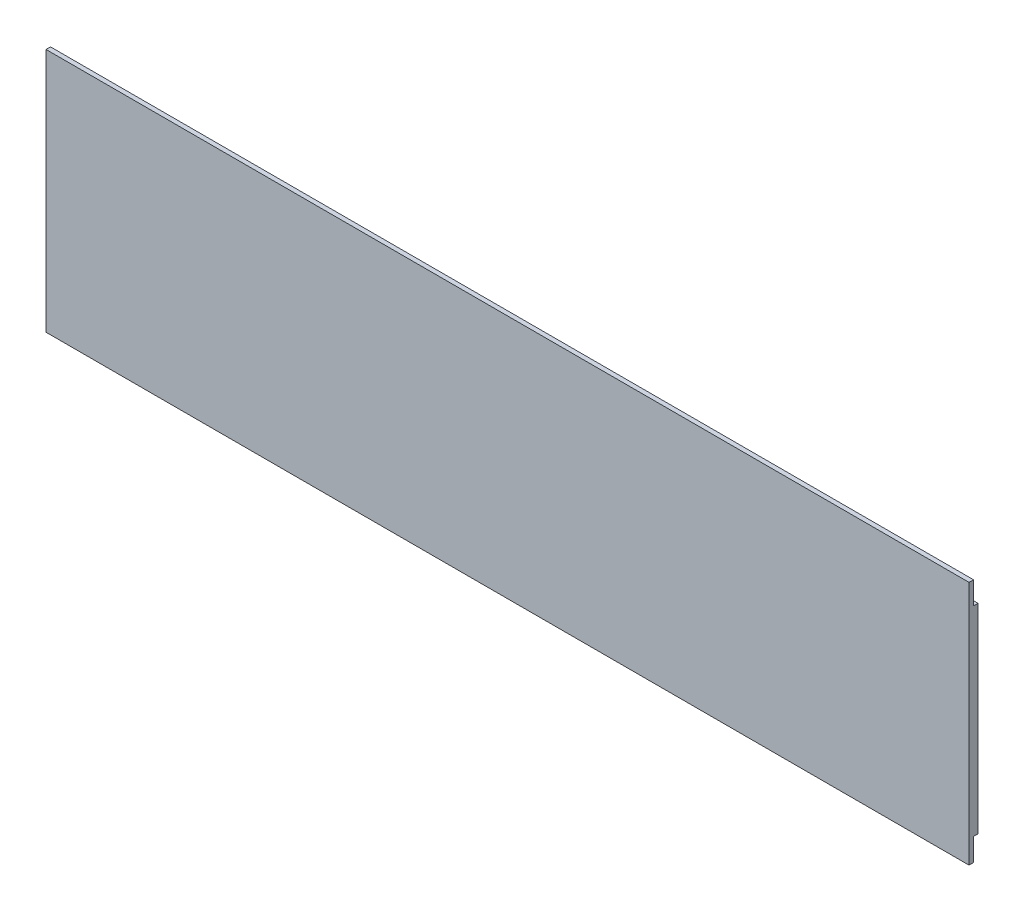
ISO-10303-21;
HEADER;
FILE_DESCRIPTION(('STEP AP214'),'2;1');
FILE_NAME('part.step','',(''),(''),'','','');
FILE_SCHEMA(('AUTOMOTIVE_DESIGN { 1 0 10303 214 1 1 1 1 }'));
ENDSEC;
DATA;
#1=APPLICATION_CONTEXT('core data for automotive mechanical design processes');
#2=APPLICATION_PROTOCOL_DEFINITION('international standard','automotive_design',2000,#1);
#3=PRODUCT_CONTEXT('',#1,'mechanical');
#4=PRODUCT('Part','Part','',(#3));
#5=PRODUCT_RELATED_PRODUCT_CATEGORY('part','',(#4));
#6=PRODUCT_DEFINITION_FORMATION('','',#4);
#7=PRODUCT_DEFINITION_CONTEXT('part definition',#1,'design');
#8=PRODUCT_DEFINITION('design','',#6,#7);
#9=PRODUCT_DEFINITION_SHAPE('','',#8);
#10=(LENGTH_UNIT() NAMED_UNIT(*) SI_UNIT(.MILLI.,.METRE.));
#11=(NAMED_UNIT(*) PLANE_ANGLE_UNIT() SI_UNIT($,.RADIAN.));
#12=(NAMED_UNIT(*) SI_UNIT($,.STERADIAN.) SOLID_ANGLE_UNIT());
#13=UNCERTAINTY_MEASURE_WITH_UNIT(LENGTH_MEASURE(1.E-05),#10,'distance_accuracy_value','');
#14=(GEOMETRIC_REPRESENTATION_CONTEXT(3) GLOBAL_UNCERTAINTY_ASSIGNED_CONTEXT((#13)) GLOBAL_UNIT_ASSIGNED_CONTEXT((#10,
#11,#12)) REPRESENTATION_CONTEXT('',''));
#15=CARTESIAN_POINT('',(0.,0.,0.));
#16=DIRECTION('',(0.,0.,1.));
#17=DIRECTION('',(1.,0.,0.));
#18=AXIS2_PLACEMENT_3D('',#15,#16,#17);
#19=CARTESIAN_POINT('',(0.,86.566214514811,3.175));
#20=DIRECTION('',(0.,-1.,0.));
#21=DIRECTION('',(0.,0.,-1.));
#22=AXIS2_PLACEMENT_3D('',#19,#20,#21);
#23=PLANE('',#22);
#24=DIRECTION('',(1.,0.,0.));
#25=VECTOR('',#24,1.);
#26=CARTESIAN_POINT('',(326.228,86.566214514811,1.5875));
#27=LINE('',#26,#25);
#28=CARTESIAN_POINT('',(0.,86.566214514811,1.5875));
#29=VERTEX_POINT('',#28);
#30=CARTESIAN_POINT('',(326.228,86.566214514811,1.5875));
#31=VERTEX_POINT('',#30);
#32=EDGE_CURVE('E144',#29,#31,#27,.T.);
#33=ORIENTED_EDGE('',*,*,#32,.F.);
#34=DIRECTION('',(0.,0.,-1.));
#35=VECTOR('',#34,1.);
#36=CARTESIAN_POINT('',(0.,86.566214514811,3.175));
#37=LINE('',#36,#35);
#38=CARTESIAN_POINT('',(0.,86.566214514811,3.175));
#39=VERTEX_POINT('',#38);
#40=EDGE_CURVE('E122',#39,#29,#37,.T.);
#41=ORIENTED_EDGE('',*,*,#40,.F.);
#42=DIRECTION('',(-1.,0.,0.));
#43=VECTOR('',#42,1.);
#44=CARTESIAN_POINT('',(0.,86.566214514811,3.175));
#45=LINE('',#44,#43);
#46=CARTESIAN_POINT('',(326.228,86.566214514811,3.175));
#47=VERTEX_POINT('',#46);
#48=EDGE_CURVE('E127',#47,#39,#45,.T.);
#49=ORIENTED_EDGE('',*,*,#48,.F.);
#50=DIRECTION('',(0.,0.,-1.));
#51=VECTOR('',#50,1.);
#52=CARTESIAN_POINT('',(326.228,86.566214514811,3.175));
#53=LINE('',#52,#51);
#54=EDGE_CURVE('E120',#47,#31,#53,.T.);
#55=ORIENTED_EDGE('',*,*,#54,.T.);
#56=EDGE_LOOP('',(#33,#41,#49,#55));
#57=FACE_BOUND('',#56,.T.);
#58=ADVANCED_FACE('F33',(#57),#23,.F.);
#59=CARTESIAN_POINT('',(0.,0.,3.175));
#60=DIRECTION('',(1.,0.,0.));
#61=DIRECTION('',(0.,0.,-1.));
#62=AXIS2_PLACEMENT_3D('',#59,#60,#61);
#63=PLANE('',#62);
#64=DIRECTION('',(0.,-1.,0.));
#65=VECTOR('',#64,1.);
#66=CARTESIAN_POINT('',(0.,0.,0.));
#67=LINE('',#66,#65);
#68=CARTESIAN_POINT('',(0.,78.5662145148111,0.));
#69=VERTEX_POINT('',#68);
#70=CARTESIAN_POINT('',(0.,7.99999999999999,0.));
#71=VERTEX_POINT('',#70);
#72=EDGE_CURVE('E132',#69,#71,#67,.T.);
#73=ORIENTED_EDGE('',*,*,#72,.T.);
#74=DIRECTION('',(0.,0.,-1.));
#75=VECTOR('',#74,1.);
#76=CARTESIAN_POINT('',(0.,7.99999999999999,1.5875));
#77=LINE('',#76,#75);
#78=CARTESIAN_POINT('',(0.,7.99999999999999,1.5875));
#79=VERTEX_POINT('',#78);
#80=EDGE_CURVE('E56',#79,#71,#77,.T.);
#81=ORIENTED_EDGE('',*,*,#80,.F.);
#82=DIRECTION('',(0.,1.,0.));
#83=VECTOR('',#82,1.);
#84=CARTESIAN_POINT('',(0.,0.,1.5875));
#85=LINE('',#84,#83);
#86=CARTESIAN_POINT('',(0.,0.,1.5875));
#87=VERTEX_POINT('',#86);
#88=EDGE_CURVE('E115',#87,#79,#85,.T.);
#89=ORIENTED_EDGE('',*,*,#88,.F.);
#90=DIRECTION('',(0.,0.,-1.));
#91=VECTOR('',#90,1.);
#92=CARTESIAN_POINT('',(0.,0.,3.175));
#93=LINE('',#92,#91);
#94=CARTESIAN_POINT('',(0.,0.,3.175));
#95=VERTEX_POINT('',#94);
#96=EDGE_CURVE('E11',#95,#87,#93,.T.);
#97=ORIENTED_EDGE('',*,*,#96,.F.);
#98=DIRECTION('',(0.,-1.,0.));
#99=VECTOR('',#98,1.);
#100=CARTESIAN_POINT('',(0.,0.,3.175));
#101=LINE('',#100,#99);
#102=EDGE_CURVE('E131',#39,#95,#101,.T.);
#103=ORIENTED_EDGE('',*,*,#102,.F.);
#104=ORIENTED_EDGE('',*,*,#40,.T.);
#105=DIRECTION('',(0.,1.,0.));
#106=VECTOR('',#105,1.);
#107=CARTESIAN_POINT('',(0.,86.566214514811,1.5875));
#108=LINE('',#107,#106);
#109=CARTESIAN_POINT('',(0.,78.5662145148111,1.5875));
#110=VERTEX_POINT('',#109);
#111=EDGE_CURVE('E151',#110,#29,#108,.T.);
#112=ORIENTED_EDGE('',*,*,#111,.F.);
#113=DIRECTION('',(0.,0.,-1.));
#114=VECTOR('',#113,1.);
#115=CARTESIAN_POINT('',(0.,78.5662145148111,1.5875));
#116=LINE('',#115,#114);
#117=EDGE_CURVE('E143',#110,#69,#116,.T.);
#118=ORIENTED_EDGE('',*,*,#117,.T.);
#119=EDGE_LOOP('',(#73,#81,#89,#97,#103,#104,#112,#118));
#120=FACE_BOUND('',#119,.T.);
#121=ADVANCED_FACE('F35',(#120),#63,.F.);
#122=CARTESIAN_POINT('',(0.,0.,3.175));
#123=DIRECTION('',(0.,1.,0.));
#124=DIRECTION('',(0.,0.,1.));
#125=AXIS2_PLACEMENT_3D('',#122,#123,#124);
#126=PLANE('',#125);
#127=ORIENTED_EDGE('',*,*,#96,.T.);
#128=DIRECTION('',(-1.,0.,0.));
#129=VECTOR('',#128,1.);
#130=CARTESIAN_POINT('',(326.228,0.,1.5875));
#131=LINE('',#130,#129);
#132=CARTESIAN_POINT('',(326.228,0.,1.5875));
#133=VERTEX_POINT('',#132);
#134=EDGE_CURVE('E102',#133,#87,#131,.T.);
#135=ORIENTED_EDGE('',*,*,#134,.F.);
#136=DIRECTION('',(0.,0.,-1.));
#137=VECTOR('',#136,1.);
#138=CARTESIAN_POINT('',(326.228,0.,3.175));
#139=LINE('',#138,#137);
#140=CARTESIAN_POINT('',(326.228,0.,3.175));
#141=VERTEX_POINT('',#140);
#142=EDGE_CURVE('E41',#141,#133,#139,.T.);
#143=ORIENTED_EDGE('',*,*,#142,.F.);
#144=DIRECTION('',(1.,0.,0.));
#145=VECTOR('',#144,1.);
#146=CARTESIAN_POINT('',(0.,0.,3.175));
#147=LINE('',#146,#145);
#148=EDGE_CURVE('E138',#95,#141,#147,.T.);
#149=ORIENTED_EDGE('',*,*,#148,.F.);
#150=EDGE_LOOP('',(#127,#135,#143,#149));
#151=FACE_BOUND('',#150,.T.);
#152=ADVANCED_FACE('F112',(#151),#126,.F.);
#153=CARTESIAN_POINT('',(326.228,0.,3.175));
#154=DIRECTION('',(-1.,0.,0.));
#155=DIRECTION('',(0.,0.,1.));
#156=AXIS2_PLACEMENT_3D('',#153,#154,#155);
#157=PLANE('',#156);
#158=DIRECTION('',(0.,-1.,0.));
#159=VECTOR('',#158,1.);
#160=CARTESIAN_POINT('',(326.228,0.,1.5875));
#161=LINE('',#160,#159);
#162=CARTESIAN_POINT('',(326.228,7.99999999999999,1.5875));
#163=VERTEX_POINT('',#162);
#164=EDGE_CURVE('E99',#163,#133,#161,.T.);
#165=ORIENTED_EDGE('',*,*,#164,.F.);
#166=DIRECTION('',(0.,0.,-1.));
#167=VECTOR('',#166,1.);
#168=CARTESIAN_POINT('',(326.228,7.99999999999999,1.5875));
#169=LINE('',#168,#167);
#170=CARTESIAN_POINT('',(326.228,7.99999999999999,0.));
#171=VERTEX_POINT('',#170);
#172=EDGE_CURVE('E135',#163,#171,#169,.T.);
#173=ORIENTED_EDGE('',*,*,#172,.T.);
#174=DIRECTION('',(0.,1.,0.));
#175=VECTOR('',#174,1.);
#176=CARTESIAN_POINT('',(326.228,0.,0.));
#177=LINE('',#176,#175);
#178=CARTESIAN_POINT('',(326.228,78.5662145148111,0.));
#179=VERTEX_POINT('',#178);
#180=EDGE_CURVE('E128',#171,#179,#177,.T.);
#181=ORIENTED_EDGE('',*,*,#180,.T.);
#182=DIRECTION('',(0.,0.,-1.));
#183=VECTOR('',#182,1.);
#184=CARTESIAN_POINT('',(326.228,78.5662145148111,1.5875));
#185=LINE('',#184,#183);
#186=CARTESIAN_POINT('',(326.228,78.5662145148111,1.5875));
#187=VERTEX_POINT('',#186);
#188=EDGE_CURVE('E48',#187,#179,#185,.T.);
#189=ORIENTED_EDGE('',*,*,#188,.F.);
#190=DIRECTION('',(0.,-1.,0.));
#191=VECTOR('',#190,1.);
#192=CARTESIAN_POINT('',(326.228,86.566214514811,1.5875));
#193=LINE('',#192,#191);
#194=EDGE_CURVE('E149',#31,#187,#193,.T.);
#195=ORIENTED_EDGE('',*,*,#194,.F.);
#196=ORIENTED_EDGE('',*,*,#54,.F.);
#197=DIRECTION('',(0.,1.,0.));
#198=VECTOR('',#197,1.);
#199=CARTESIAN_POINT('',(326.228,0.,3.175));
#200=LINE('',#199,#198);
#201=EDGE_CURVE('E119',#141,#47,#200,.T.);
#202=ORIENTED_EDGE('',*,*,#201,.F.);
#203=ORIENTED_EDGE('',*,*,#142,.T.);
#204=EDGE_LOOP('',(#165,#173,#181,#189,#195,#196,#202,#203));
#205=FACE_BOUND('',#204,.T.);
#206=ADVANCED_FACE('F117',(#205),#157,.F.);
#207=CARTESIAN_POINT('',(0.,0.,3.175));
#208=DIRECTION('',(0.,0.,-1.));
#209=DIRECTION('',(-1.,0.,0.));
#210=AXIS2_PLACEMENT_3D('',#207,#208,#209);
#211=PLANE('',#210);
#212=ORIENTED_EDGE('',*,*,#102,.T.);
#213=ORIENTED_EDGE('',*,*,#148,.T.);
#214=ORIENTED_EDGE('',*,*,#201,.T.);
#215=ORIENTED_EDGE('',*,*,#48,.T.);
#216=EDGE_LOOP('',(#212,#213,#214,#215));
#217=FACE_BOUND('',#216,.T.);
#218=ADVANCED_FACE('F177',(#217),#211,.F.);
#219=CARTESIAN_POINT('',(0.,0.,0.));
#220=DIRECTION('',(0.,0.,-1.));
#221=DIRECTION('',(-1.,0.,0.));
#222=AXIS2_PLACEMENT_3D('',#219,#220,#221);
#223=PLANE('',#222);
#224=DIRECTION('',(1.,0.,0.));
#225=VECTOR('',#224,1.);
#226=CARTESIAN_POINT('',(326.228,7.99999999999999,0.));
#227=LINE('',#226,#225);
#228=EDGE_CURVE('E108',#71,#171,#227,.T.);
#229=ORIENTED_EDGE('',*,*,#228,.F.);
#230=ORIENTED_EDGE('',*,*,#72,.F.);
#231=DIRECTION('',(-1.,0.,0.));
#232=VECTOR('',#231,1.);
#233=CARTESIAN_POINT('',(326.228,78.5662145148111,0.));
#234=LINE('',#233,#232);
#235=EDGE_CURVE('E147',#179,#69,#234,.T.);
#236=ORIENTED_EDGE('',*,*,#235,.F.);
#237=ORIENTED_EDGE('',*,*,#180,.F.);
#238=EDGE_LOOP('',(#229,#230,#236,#237));
#239=FACE_BOUND('',#238,.T.);
#240=ADVANCED_FACE('F167',(#239),#223,.T.);
#241=CARTESIAN_POINT('',(326.228,78.5662145148111,1.5875));
#242=DIRECTION('',(0.,-1.,0.));
#243=DIRECTION('',(0.,0.,-1.));
#244=AXIS2_PLACEMENT_3D('',#241,#242,#243);
#245=PLANE('',#244);
#246=ORIENTED_EDGE('',*,*,#235,.T.);
#247=ORIENTED_EDGE('',*,*,#117,.F.);
#248=DIRECTION('',(-1.,0.,0.));
#249=VECTOR('',#248,1.);
#250=CARTESIAN_POINT('',(326.228,78.5662145148111,1.5875));
#251=LINE('',#250,#249);
#252=EDGE_CURVE('E153',#187,#110,#251,.T.);
#253=ORIENTED_EDGE('',*,*,#252,.F.);
#254=ORIENTED_EDGE('',*,*,#188,.T.);
#255=EDGE_LOOP('',(#246,#247,#253,#254));
#256=FACE_BOUND('',#255,.T.);
#257=ADVANCED_FACE('F179',(#256),#245,.F.);
#258=CARTESIAN_POINT('',(0.,0.,1.5875));
#259=DIRECTION('',(0.,0.,-1.));
#260=DIRECTION('',(-1.,0.,0.));
#261=AXIS2_PLACEMENT_3D('',#258,#259,#260);
#262=PLANE('',#261);
#263=ORIENTED_EDGE('',*,*,#194,.T.);
#264=ORIENTED_EDGE('',*,*,#252,.T.);
#265=ORIENTED_EDGE('',*,*,#111,.T.);
#266=ORIENTED_EDGE('',*,*,#32,.T.);
#267=EDGE_LOOP('',(#263,#264,#265,#266));
#268=FACE_BOUND('',#267,.T.);
#269=ADVANCED_FACE('F178',(#268),#262,.T.);
#270=CARTESIAN_POINT('',(326.228,7.99999999999999,1.5875));
#271=DIRECTION('',(0.,1.,0.));
#272=DIRECTION('',(0.,0.,1.));
#273=AXIS2_PLACEMENT_3D('',#270,#271,#272);
#274=PLANE('',#273);
#275=ORIENTED_EDGE('',*,*,#228,.T.);
#276=ORIENTED_EDGE('',*,*,#172,.F.);
#277=DIRECTION('',(1.,0.,0.));
#278=VECTOR('',#277,1.);
#279=CARTESIAN_POINT('',(326.228,7.99999999999999,1.5875));
#280=LINE('',#279,#278);
#281=EDGE_CURVE('E104',#79,#163,#280,.T.);
#282=ORIENTED_EDGE('',*,*,#281,.F.);
#283=ORIENTED_EDGE('',*,*,#80,.T.);
#284=EDGE_LOOP('',(#275,#276,#282,#283));
#285=FACE_BOUND('',#284,.T.);
#286=ADVANCED_FACE('F163',(#285),#274,.F.);
#287=CARTESIAN_POINT('',(0.,0.,1.5875));
#288=DIRECTION('',(0.,0.,1.));
#289=DIRECTION('',(1.,0.,0.));
#290=AXIS2_PLACEMENT_3D('',#287,#288,#289);
#291=PLANE('',#290);
#292=ORIENTED_EDGE('',*,*,#164,.T.);
#293=ORIENTED_EDGE('',*,*,#134,.T.);
#294=ORIENTED_EDGE('',*,*,#88,.T.);
#295=ORIENTED_EDGE('',*,*,#281,.T.);
#296=EDGE_LOOP('',(#292,#293,#294,#295));
#297=FACE_BOUND('',#296,.T.);
#298=ADVANCED_FACE('F101',(#297),#291,.F.);
#299=CLOSED_SHELL('',(#58,#121,#152,#206,#218,#240,#257,#269,#286,#298));
#300=MANIFOLD_SOLID_BREP('B2',#299);
#301=ADVANCED_BREP_SHAPE_REPRESENTATION('',(#18,#300),#14);
#302=SHAPE_DEFINITION_REPRESENTATION(#9,#301);
ENDSEC;
END-ISO-10303-21;
